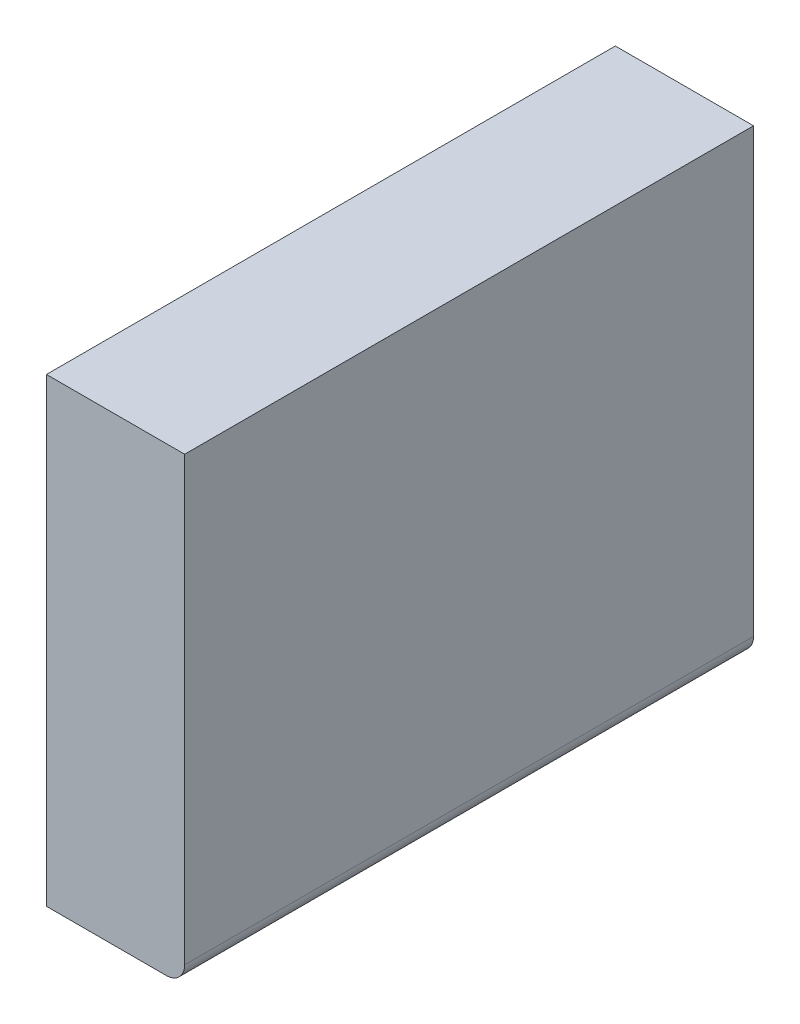
ISO-10303-21;
HEADER;
FILE_DESCRIPTION(('STEP AP214'),'2;1');
FILE_NAME('part.step','',(''),(''),'','','');
FILE_SCHEMA(('AUTOMOTIVE_DESIGN { 1 0 10303 214 1 1 1 1 }'));
ENDSEC;
DATA;
#1=APPLICATION_CONTEXT('core data for automotive mechanical design processes');
#2=APPLICATION_PROTOCOL_DEFINITION('international standard','automotive_design',2000,#1);
#3=PRODUCT_CONTEXT('',#1,'mechanical');
#4=PRODUCT('Part','Part','',(#3));
#5=PRODUCT_RELATED_PRODUCT_CATEGORY('part','',(#4));
#6=PRODUCT_DEFINITION_FORMATION('','',#4);
#7=PRODUCT_DEFINITION_CONTEXT('part definition',#1,'design');
#8=PRODUCT_DEFINITION('design','',#6,#7);
#9=PRODUCT_DEFINITION_SHAPE('','',#8);
#10=(LENGTH_UNIT() NAMED_UNIT(*) SI_UNIT(.MILLI.,.METRE.));
#11=(NAMED_UNIT(*) PLANE_ANGLE_UNIT() SI_UNIT($,.RADIAN.));
#12=(NAMED_UNIT(*) SI_UNIT($,.STERADIAN.) SOLID_ANGLE_UNIT());
#13=UNCERTAINTY_MEASURE_WITH_UNIT(LENGTH_MEASURE(1.E-05),#10,'distance_accuracy_value','');
#14=(GEOMETRIC_REPRESENTATION_CONTEXT(3) GLOBAL_UNCERTAINTY_ASSIGNED_CONTEXT((#13)) GLOBAL_UNIT_ASSIGNED_CONTEXT((#10,
#11,#12)) REPRESENTATION_CONTEXT('',''));
#15=CARTESIAN_POINT('',(0.,0.,0.));
#16=DIRECTION('',(0.,0.,1.));
#17=DIRECTION('',(1.,0.,0.));
#18=AXIS2_PLACEMENT_3D('',#15,#16,#17);
#19=CARTESIAN_POINT('',(-7.5,-50.,30.875));
#20=DIRECTION('',(1.,0.,0.));
#21=DIRECTION('',(0.,0.,-1.));
#22=AXIS2_PLACEMENT_3D('',#19,#20,#21);
#23=PLANE('',#22);
#24=DIRECTION('',(0.,-1.,0.));
#25=VECTOR('',#24,1.);
#26=CARTESIAN_POINT('',(-7.5,-50.,-30.875));
#27=LINE('',#26,#25);
#28=CARTESIAN_POINT('',(-7.5,0.,-30.875));
#29=VERTEX_POINT('',#28);
#30=CARTESIAN_POINT('',(-7.5,-50.,-30.875));
#31=VERTEX_POINT('',#30);
#32=EDGE_CURVE('E105',#29,#31,#27,.T.);
#33=ORIENTED_EDGE('',*,*,#32,.T.);
#34=DIRECTION('',(0.,0.,-1.));
#35=VECTOR('',#34,1.);
#36=CARTESIAN_POINT('',(-7.5,-50.,30.875));
#37=LINE('',#36,#35);
#38=CARTESIAN_POINT('',(-7.5,-50.,30.875));
#39=VERTEX_POINT('',#38);
#40=EDGE_CURVE('E88',#39,#31,#37,.T.);
#41=ORIENTED_EDGE('',*,*,#40,.F.);
#42=DIRECTION('',(0.,-1.,0.));
#43=VECTOR('',#42,1.);
#44=CARTESIAN_POINT('',(-7.5,-50.,30.875));
#45=LINE('',#44,#43);
#46=CARTESIAN_POINT('',(-7.5,0.,30.875));
#47=VERTEX_POINT('',#46);
#48=EDGE_CURVE('E93',#47,#39,#45,.T.);
#49=ORIENTED_EDGE('',*,*,#48,.F.);
#50=DIRECTION('',(0.,0.,-1.));
#51=VECTOR('',#50,1.);
#52=CARTESIAN_POINT('',(-7.5,0.,30.875));
#53=LINE('',#52,#51);
#54=EDGE_CURVE('E112',#47,#29,#53,.T.);
#55=ORIENTED_EDGE('',*,*,#54,.T.);
#56=EDGE_LOOP('',(#33,#41,#49,#55));
#57=FACE_BOUND('',#56,.T.);
#58=ADVANCED_FACE('F41',(#57),#23,.F.);
#59=CARTESIAN_POINT('',(-7.5,-50.,30.875));
#60=DIRECTION('',(0.,1.,0.));
#61=DIRECTION('',(0.,0.,1.));
#62=AXIS2_PLACEMENT_3D('',#59,#60,#61);
#63=PLANE('',#62);
#64=DIRECTION('',(1.,0.,0.));
#65=VECTOR('',#64,1.);
#66=CARTESIAN_POINT('',(-7.5,-50.,-30.875));
#67=LINE('',#66,#65);
#68=CARTESIAN_POINT('',(5.50000000000002,-50.,-30.875));
#69=VERTEX_POINT('',#68);
#70=EDGE_CURVE('E120',#31,#69,#67,.T.);
#71=ORIENTED_EDGE('',*,*,#70,.T.);
#72=DIRECTION('',(0.,0.,-1.));
#73=VECTOR('',#72,1.);
#74=CARTESIAN_POINT('',(5.50000000000002,-50.,30.875));
#75=LINE('',#74,#73);
#76=CARTESIAN_POINT('',(5.50000000000002,-50.,30.875));
#77=VERTEX_POINT('',#76);
#78=EDGE_CURVE('E49',#69,#77,#75,.F.);
#79=ORIENTED_EDGE('',*,*,#78,.T.);
#80=DIRECTION('',(1.,0.,0.));
#81=VECTOR('',#80,1.);
#82=CARTESIAN_POINT('',(-7.5,-50.,30.875));
#83=LINE('',#82,#81);
#84=EDGE_CURVE('E84',#39,#77,#83,.T.);
#85=ORIENTED_EDGE('',*,*,#84,.F.);
#86=ORIENTED_EDGE('',*,*,#40,.T.);
#87=EDGE_LOOP('',(#71,#79,#85,#86));
#88=FACE_BOUND('',#87,.T.);
#89=ADVANCED_FACE('F86',(#88),#63,.F.);
#90=CARTESIAN_POINT('',(7.50000000000002,-50.,30.875));
#91=DIRECTION('',(-1.,0.,0.));
#92=DIRECTION('',(0.,-1.,0.));
#93=AXIS2_PLACEMENT_3D('',#90,#91,#92);
#94=PLANE('',#93);
#95=DIRECTION('',(0.,1.,0.));
#96=VECTOR('',#95,1.);
#97=CARTESIAN_POINT('',(7.50000000000002,-50.,30.875));
#98=LINE('',#97,#96);
#99=CARTESIAN_POINT('',(7.50000000000002,-48.,30.875));
#100=VERTEX_POINT('',#99);
#101=CARTESIAN_POINT('',(7.5,0.,30.875));
#102=VERTEX_POINT('',#101);
#103=EDGE_CURVE('E92',#100,#102,#98,.T.);
#104=ORIENTED_EDGE('',*,*,#103,.F.);
#105=DIRECTION('',(0.,0.,-1.));
#106=VECTOR('',#105,1.);
#107=CARTESIAN_POINT('',(7.50000000000002,-48.,30.875));
#108=LINE('',#107,#106);
#109=CARTESIAN_POINT('',(7.50000000000002,-48.,-30.875));
#110=VERTEX_POINT('',#109);
#111=EDGE_CURVE('E106',#100,#110,#108,.T.);
#112=ORIENTED_EDGE('',*,*,#111,.T.);
#113=DIRECTION('',(0.,1.,0.));
#114=VECTOR('',#113,1.);
#115=CARTESIAN_POINT('',(7.50000000000002,-50.,-30.875));
#116=LINE('',#115,#114);
#117=CARTESIAN_POINT('',(7.5,0.,-30.875));
#118=VERTEX_POINT('',#117);
#119=EDGE_CURVE('E118',#110,#118,#116,.T.);
#120=ORIENTED_EDGE('',*,*,#119,.T.);
#121=DIRECTION('',(0.,0.,-1.));
#122=VECTOR('',#121,1.);
#123=CARTESIAN_POINT('',(7.5,0.,30.875));
#124=LINE('',#123,#122);
#125=EDGE_CURVE('E107',#102,#118,#124,.T.);
#126=ORIENTED_EDGE('',*,*,#125,.F.);
#127=EDGE_LOOP('',(#104,#112,#120,#126));
#128=FACE_BOUND('',#127,.T.);
#129=ADVANCED_FACE('F128',(#128),#94,.F.);
#130=CARTESIAN_POINT('',(-7.5,0.,30.875));
#131=DIRECTION('',(0.,-1.,0.));
#132=DIRECTION('',(1.,0.,0.));
#133=AXIS2_PLACEMENT_3D('',#130,#131,#132);
#134=PLANE('',#133);
#135=DIRECTION('',(-1.,0.,0.));
#136=VECTOR('',#135,1.);
#137=CARTESIAN_POINT('',(-7.5,0.,-30.875));
#138=LINE('',#137,#136);
#139=EDGE_CURVE('E102',#118,#29,#138,.T.);
#140=ORIENTED_EDGE('',*,*,#139,.T.);
#141=ORIENTED_EDGE('',*,*,#54,.F.);
#142=DIRECTION('',(-1.,0.,0.));
#143=VECTOR('',#142,1.);
#144=CARTESIAN_POINT('',(-7.5,0.,30.875));
#145=LINE('',#144,#143);
#146=EDGE_CURVE('E98',#102,#47,#145,.T.);
#147=ORIENTED_EDGE('',*,*,#146,.F.);
#148=ORIENTED_EDGE('',*,*,#125,.T.);
#149=EDGE_LOOP('',(#140,#141,#147,#148));
#150=FACE_BOUND('',#149,.T.);
#151=ADVANCED_FACE('F131',(#150),#134,.F.);
#152=CARTESIAN_POINT('',(0.,0.,30.875));
#153=DIRECTION('',(0.,0.,-1.));
#154=DIRECTION('',(-1.,0.,0.));
#155=AXIS2_PLACEMENT_3D('',#152,#153,#154);
#156=PLANE('',#155);
#157=ORIENTED_EDGE('',*,*,#84,.T.);
#158=CARTESIAN_POINT('',(5.50000000000002,-48.,30.875));
#159=DIRECTION('',(0.,0.,-1.));
#160=DIRECTION('',(-1.,0.,0.));
#161=AXIS2_PLACEMENT_3D('',#158,#159,#160);
#162=CIRCLE('',#161,2.);
#163=EDGE_CURVE('E11',#77,#100,#162,.F.);
#164=ORIENTED_EDGE('',*,*,#163,.T.);
#165=ORIENTED_EDGE('',*,*,#103,.T.);
#166=ORIENTED_EDGE('',*,*,#146,.T.);
#167=ORIENTED_EDGE('',*,*,#48,.T.);
#168=EDGE_LOOP('',(#157,#164,#165,#166,#167));
#169=FACE_BOUND('',#168,.T.);
#170=ADVANCED_FACE('F96',(#169),#156,.F.);
#171=CARTESIAN_POINT('',(0.,0.,-30.875));
#172=DIRECTION('',(0.,0.,-1.));
#173=DIRECTION('',(-1.,0.,0.));
#174=AXIS2_PLACEMENT_3D('',#171,#172,#173);
#175=PLANE('',#174);
#176=ORIENTED_EDGE('',*,*,#119,.F.);
#177=CARTESIAN_POINT('',(5.50000000000002,-48.,-30.875));
#178=DIRECTION('',(0.,0.,-1.));
#179=DIRECTION('',(-1.,0.,0.));
#180=AXIS2_PLACEMENT_3D('',#177,#178,#179);
#181=CIRCLE('',#180,2.);
#182=EDGE_CURVE('E63',#110,#69,#181,.T.);
#183=ORIENTED_EDGE('',*,*,#182,.T.);
#184=ORIENTED_EDGE('',*,*,#70,.F.);
#185=ORIENTED_EDGE('',*,*,#32,.F.);
#186=ORIENTED_EDGE('',*,*,#139,.F.);
#187=EDGE_LOOP('',(#176,#183,#184,#185,#186));
#188=FACE_BOUND('',#187,.T.);
#189=ADVANCED_FACE('F132',(#188),#175,.T.);
#190=CARTESIAN_POINT('',(5.50000000000002,-48.,30.875));
#191=DIRECTION('',(0.,0.,-1.));
#192=DIRECTION('',(-1.,0.,0.));
#193=AXIS2_PLACEMENT_3D('',#190,#191,#192);
#194=CYLINDRICAL_SURFACE('',#193,2.);
#195=ORIENTED_EDGE('',*,*,#163,.F.);
#196=ORIENTED_EDGE('',*,*,#78,.F.);
#197=ORIENTED_EDGE('',*,*,#182,.F.);
#198=ORIENTED_EDGE('',*,*,#111,.F.);
#199=EDGE_LOOP('',(#195,#196,#197,#198));
#200=FACE_BOUND('',#199,.T.);
#201=ADVANCED_FACE('F43',(#200),#194,.T.);
#202=CLOSED_SHELL('',(#58,#89,#129,#151,#170,#189,#201));
#203=MANIFOLD_SOLID_BREP('B2',#202);
#204=ADVANCED_BREP_SHAPE_REPRESENTATION('',(#18,#203),#14);
#205=SHAPE_DEFINITION_REPRESENTATION(#9,#204);
ENDSEC;
END-ISO-10303-21;
